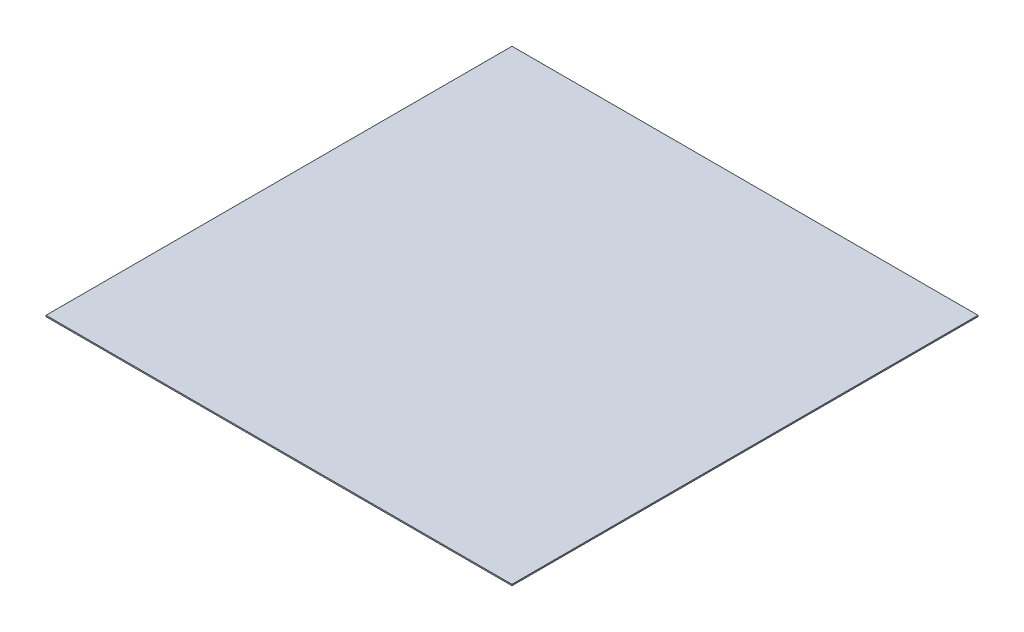
ISO-10303-21;
HEADER;
FILE_DESCRIPTION(('STEP AP214'),'2;1');
FILE_NAME('part.step','',(''),(''),'','','');
FILE_SCHEMA(('AUTOMOTIVE_DESIGN { 1 0 10303 214 1 1 1 1 }'));
ENDSEC;
DATA;
#1=APPLICATION_CONTEXT('core data for automotive mechanical design processes');
#2=APPLICATION_PROTOCOL_DEFINITION('international standard','automotive_design',2000,#1);
#3=PRODUCT_CONTEXT('',#1,'mechanical');
#4=PRODUCT('Part','Part','',(#3));
#5=PRODUCT_RELATED_PRODUCT_CATEGORY('part','',(#4));
#6=PRODUCT_DEFINITION_FORMATION('','',#4);
#7=PRODUCT_DEFINITION_CONTEXT('part definition',#1,'design');
#8=PRODUCT_DEFINITION('design','',#6,#7);
#9=PRODUCT_DEFINITION_SHAPE('','',#8);
#10=(LENGTH_UNIT() NAMED_UNIT(*) SI_UNIT(.MILLI.,.METRE.));
#11=(NAMED_UNIT(*) PLANE_ANGLE_UNIT() SI_UNIT($,.RADIAN.));
#12=(NAMED_UNIT(*) SI_UNIT($,.STERADIAN.) SOLID_ANGLE_UNIT());
#13=UNCERTAINTY_MEASURE_WITH_UNIT(LENGTH_MEASURE(1.E-05),#10,'distance_accuracy_value','');
#14=(GEOMETRIC_REPRESENTATION_CONTEXT(3) GLOBAL_UNCERTAINTY_ASSIGNED_CONTEXT((#13)) GLOBAL_UNIT_ASSIGNED_CONTEXT((#10,
#11,#12)) REPRESENTATION_CONTEXT('',''));
#15=CARTESIAN_POINT('',(0.,0.,0.));
#16=DIRECTION('',(0.,0.,1.));
#17=DIRECTION('',(1.,0.,0.));
#18=AXIS2_PLACEMENT_3D('',#15,#16,#17);
#19=CARTESIAN_POINT('',(1828.8,10.,-1828.8));
#20=DIRECTION('',(-1.,0.,0.));
#21=DIRECTION('',(0.,0.,1.));
#22=AXIS2_PLACEMENT_3D('',#19,#20,#21);
#23=PLANE('',#22);
#24=DIRECTION('',(0.,0.,-1.));
#25=VECTOR('',#24,1.);
#26=CARTESIAN_POINT('',(1828.8,0.,-1828.8));
#27=LINE('',#26,#25);
#28=CARTESIAN_POINT('',(1828.8,0.,1828.8));
#29=VERTEX_POINT('',#28);
#30=CARTESIAN_POINT('',(1828.8,0.,-1828.8));
#31=VERTEX_POINT('',#30);
#32=EDGE_CURVE('E113',#29,#31,#27,.T.);
#33=ORIENTED_EDGE('',*,*,#32,.T.);
#34=DIRECTION('',(0.,-1.,0.));
#35=VECTOR('',#34,1.);
#36=CARTESIAN_POINT('',(1828.8,10.,-1828.8));
#37=LINE('',#36,#35);
#38=CARTESIAN_POINT('',(1828.8,10.,-1828.8));
#39=VERTEX_POINT('',#38);
#40=EDGE_CURVE('E11',#39,#31,#37,.T.);
#41=ORIENTED_EDGE('',*,*,#40,.F.);
#42=DIRECTION('',(0.,0.,-1.));
#43=VECTOR('',#42,1.);
#44=CARTESIAN_POINT('',(1828.8,10.,-1828.8));
#45=LINE('',#44,#43);
#46=CARTESIAN_POINT('',(1828.8,10.,1828.8));
#47=VERTEX_POINT('',#46);
#48=EDGE_CURVE('E97',#47,#39,#45,.T.);
#49=ORIENTED_EDGE('',*,*,#48,.F.);
#50=DIRECTION('',(0.,-1.,0.));
#51=VECTOR('',#50,1.);
#52=CARTESIAN_POINT('',(1828.8,10.,1828.8));
#53=LINE('',#52,#51);
#54=EDGE_CURVE('E109',#47,#29,#53,.T.);
#55=ORIENTED_EDGE('',*,*,#54,.T.);
#56=EDGE_LOOP('',(#33,#41,#49,#55));
#57=FACE_BOUND('',#56,.T.);
#58=ADVANCED_FACE('F45',(#57),#23,.F.);
#59=CARTESIAN_POINT('',(-1828.8,10.,-1828.8));
#60=DIRECTION('',(0.,0.,1.));
#61=DIRECTION('',(1.,0.,0.));
#62=AXIS2_PLACEMENT_3D('',#59,#60,#61);
#63=PLANE('',#62);
#64=DIRECTION('',(-1.,0.,0.));
#65=VECTOR('',#64,1.);
#66=CARTESIAN_POINT('',(-1828.8,0.,-1828.8));
#67=LINE('',#66,#65);
#68=CARTESIAN_POINT('',(-1828.8,0.,-1828.8));
#69=VERTEX_POINT('',#68);
#70=EDGE_CURVE('E102',#31,#69,#67,.T.);
#71=ORIENTED_EDGE('',*,*,#70,.T.);
#72=DIRECTION('',(0.,-1.,0.));
#73=VECTOR('',#72,1.);
#74=CARTESIAN_POINT('',(-1828.8,10.,-1828.8));
#75=LINE('',#74,#73);
#76=CARTESIAN_POINT('',(-1828.8,10.,-1828.8));
#77=VERTEX_POINT('',#76);
#78=EDGE_CURVE('E54',#77,#69,#75,.T.);
#79=ORIENTED_EDGE('',*,*,#78,.F.);
#80=DIRECTION('',(-1.,0.,0.));
#81=VECTOR('',#80,1.);
#82=CARTESIAN_POINT('',(-1828.8,10.,-1828.8));
#83=LINE('',#82,#81);
#84=EDGE_CURVE('E92',#39,#77,#83,.T.);
#85=ORIENTED_EDGE('',*,*,#84,.F.);
#86=ORIENTED_EDGE('',*,*,#40,.T.);
#87=EDGE_LOOP('',(#71,#79,#85,#86));
#88=FACE_BOUND('',#87,.T.);
#89=ADVANCED_FACE('F101',(#88),#63,.F.);
#90=CARTESIAN_POINT('',(-1828.8,10.,-1828.8));
#91=DIRECTION('',(1.,0.,0.));
#92=DIRECTION('',(0.,0.,-1.));
#93=AXIS2_PLACEMENT_3D('',#90,#91,#92);
#94=PLANE('',#93);
#95=DIRECTION('',(0.,0.,1.));
#96=VECTOR('',#95,1.);
#97=CARTESIAN_POINT('',(-1828.8,0.,-1828.8));
#98=LINE('',#97,#96);
#99=CARTESIAN_POINT('',(-1828.8,0.,1828.8));
#100=VERTEX_POINT('',#99);
#101=EDGE_CURVE('E79',#69,#100,#98,.T.);
#102=ORIENTED_EDGE('',*,*,#101,.T.);
#103=DIRECTION('',(0.,-1.,0.));
#104=VECTOR('',#103,1.);
#105=CARTESIAN_POINT('',(-1828.8,10.,1828.8));
#106=LINE('',#105,#104);
#107=CARTESIAN_POINT('',(-1828.8,10.,1828.8));
#108=VERTEX_POINT('',#107);
#109=EDGE_CURVE('E104',#108,#100,#106,.T.);
#110=ORIENTED_EDGE('',*,*,#109,.F.);
#111=DIRECTION('',(0.,0.,1.));
#112=VECTOR('',#111,1.);
#113=CARTESIAN_POINT('',(-1828.8,10.,-1828.8));
#114=LINE('',#113,#112);
#115=EDGE_CURVE('E95',#77,#108,#114,.T.);
#116=ORIENTED_EDGE('',*,*,#115,.F.);
#117=ORIENTED_EDGE('',*,*,#78,.T.);
#118=EDGE_LOOP('',(#102,#110,#116,#117));
#119=FACE_BOUND('',#118,.T.);
#120=ADVANCED_FACE('F105',(#119),#94,.F.);
#121=CARTESIAN_POINT('',(-1828.8,10.,1828.8));
#122=DIRECTION('',(0.,0.,-1.));
#123=DIRECTION('',(-1.,0.,0.));
#124=AXIS2_PLACEMENT_3D('',#121,#122,#123);
#125=PLANE('',#124);
#126=DIRECTION('',(1.,0.,0.));
#127=VECTOR('',#126,1.);
#128=CARTESIAN_POINT('',(-1828.8,0.,1828.8));
#129=LINE('',#128,#127);
#130=EDGE_CURVE('E85',#100,#29,#129,.T.);
#131=ORIENTED_EDGE('',*,*,#130,.T.);
#132=ORIENTED_EDGE('',*,*,#54,.F.);
#133=DIRECTION('',(1.,0.,0.));
#134=VECTOR('',#133,1.);
#135=CARTESIAN_POINT('',(-1828.8,10.,1828.8));
#136=LINE('',#135,#134);
#137=EDGE_CURVE('E62',#108,#47,#136,.T.);
#138=ORIENTED_EDGE('',*,*,#137,.F.);
#139=ORIENTED_EDGE('',*,*,#109,.T.);
#140=EDGE_LOOP('',(#131,#132,#138,#139));
#141=FACE_BOUND('',#140,.T.);
#142=ADVANCED_FACE('F126',(#141),#125,.F.);
#143=CARTESIAN_POINT('',(0.,10.,0.));
#144=DIRECTION('',(0.,1.,0.));
#145=DIRECTION('',(0.,0.,1.));
#146=AXIS2_PLACEMENT_3D('',#143,#144,#145);
#147=PLANE('',#146);
#148=ORIENTED_EDGE('',*,*,#48,.T.);
#149=ORIENTED_EDGE('',*,*,#84,.T.);
#150=ORIENTED_EDGE('',*,*,#115,.T.);
#151=ORIENTED_EDGE('',*,*,#137,.T.);
#152=EDGE_LOOP('',(#148,#149,#150,#151));
#153=FACE_BOUND('',#152,.T.);
#154=ADVANCED_FACE('F93',(#153),#147,.T.);
#155=CARTESIAN_POINT('',(0.,0.,0.));
#156=DIRECTION('',(0.,1.,0.));
#157=DIRECTION('',(0.,0.,1.));
#158=AXIS2_PLACEMENT_3D('',#155,#156,#157);
#159=PLANE('',#158);
#160=ORIENTED_EDGE('',*,*,#32,.F.);
#161=ORIENTED_EDGE('',*,*,#130,.F.);
#162=ORIENTED_EDGE('',*,*,#101,.F.);
#163=ORIENTED_EDGE('',*,*,#70,.F.);
#164=EDGE_LOOP('',(#160,#161,#162,#163));
#165=FACE_BOUND('',#164,.T.);
#166=ADVANCED_FACE('F129',(#165),#159,.F.);
#167=CLOSED_SHELL('',(#58,#89,#120,#142,#154,#166));
#168=MANIFOLD_SOLID_BREP('B2',#167);
#169=ADVANCED_BREP_SHAPE_REPRESENTATION('',(#18,#168),#14);
#170=SHAPE_DEFINITION_REPRESENTATION(#9,#169);
ENDSEC;
END-ISO-10303-21;
